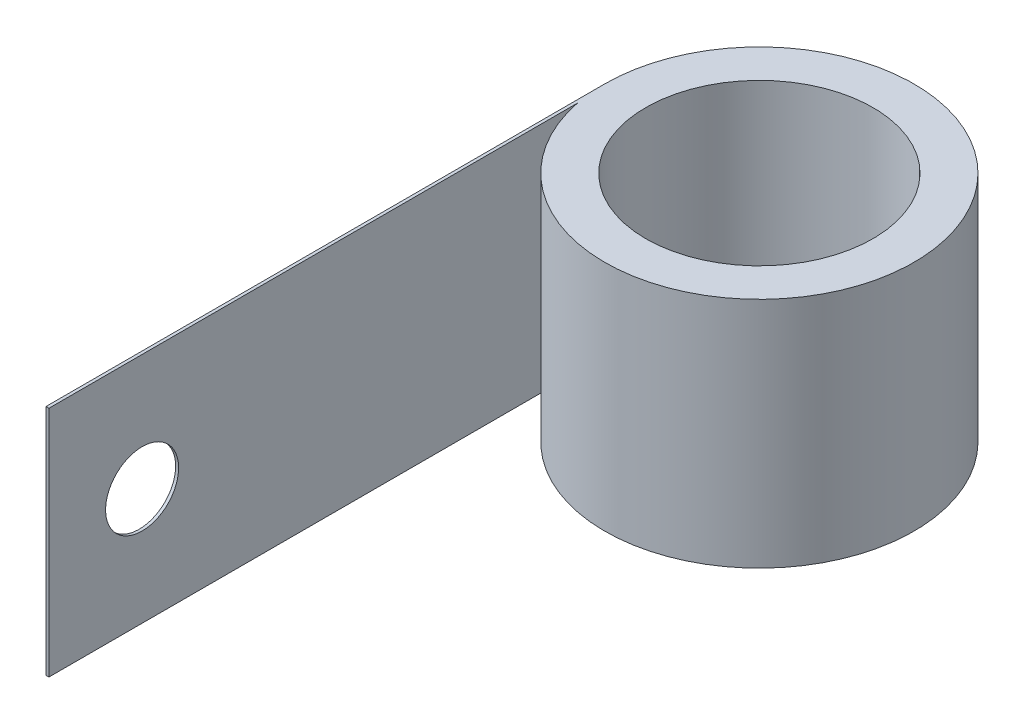
ISO-10303-21;
HEADER;
FILE_DESCRIPTION(('STEP AP214'),'2;1');
FILE_NAME('part.step','',(''),(''),'','','');
FILE_SCHEMA(('AUTOMOTIVE_DESIGN { 1 0 10303 214 1 1 1 1 }'));
ENDSEC;
DATA;
#1=APPLICATION_CONTEXT('core data for automotive mechanical design processes');
#2=APPLICATION_PROTOCOL_DEFINITION('international standard','automotive_design',2000,#1);
#3=PRODUCT_CONTEXT('',#1,'mechanical');
#4=PRODUCT('Part','Part','',(#3));
#5=PRODUCT_RELATED_PRODUCT_CATEGORY('part','',(#4));
#6=PRODUCT_DEFINITION_FORMATION('','',#4);
#7=PRODUCT_DEFINITION_CONTEXT('part definition',#1,'design');
#8=PRODUCT_DEFINITION('design','',#6,#7);
#9=PRODUCT_DEFINITION_SHAPE('','',#8);
#10=(LENGTH_UNIT() NAMED_UNIT(*) SI_UNIT(.MILLI.,.METRE.));
#11=(NAMED_UNIT(*) PLANE_ANGLE_UNIT() SI_UNIT($,.RADIAN.));
#12=(NAMED_UNIT(*) SI_UNIT($,.STERADIAN.) SOLID_ANGLE_UNIT());
#13=UNCERTAINTY_MEASURE_WITH_UNIT(LENGTH_MEASURE(1.E-05),#10,'distance_accuracy_value','');
#14=(GEOMETRIC_REPRESENTATION_CONTEXT(3) GLOBAL_UNCERTAINTY_ASSIGNED_CONTEXT((#13)) GLOBAL_UNIT_ASSIGNED_CONTEXT((#10,
#11,#12)) REPRESENTATION_CONTEXT('',''));
#15=CARTESIAN_POINT('',(0.,0.,0.));
#16=DIRECTION('',(0.,0.,1.));
#17=DIRECTION('',(1.,0.,0.));
#18=AXIS2_PLACEMENT_3D('',#15,#16,#17);
#19=CARTESIAN_POINT('',(-10.541,7.9375,31.75));
#20=DIRECTION('',(1.,0.,0.));
#21=DIRECTION('',(0.,0.,-1.));
#22=AXIS2_PLACEMENT_3D('',#19,#20,#21);
#23=CYLINDRICAL_SURFACE('',#22,2.4892);
#24=CARTESIAN_POINT('',(-10.541,7.9375,31.75));
#25=DIRECTION('',(1.,0.,0.));
#26=DIRECTION('',(0.,0.,-1.));
#27=AXIS2_PLACEMENT_3D('',#24,#25,#26);
#28=CIRCLE('',#27,2.4892);
#29=CARTESIAN_POINT('',(-10.541,7.9375,29.2608));
#30=VERTEX_POINT('',#29);
#31=EDGE_CURVE('E93',#30,#30,#28,.T.);
#32=ORIENTED_EDGE('',*,*,#31,.F.);
#33=EDGE_LOOP('',(#32));
#34=FACE_BOUND('',#33,.T.);
#35=CARTESIAN_POINT('',(-10.3378,7.9375,31.75));
#36=DIRECTION('',(1.,0.,0.));
#37=DIRECTION('',(0.,0.,-1.));
#38=AXIS2_PLACEMENT_3D('',#35,#36,#37);
#39=CIRCLE('',#38,2.4892);
#40=CARTESIAN_POINT('',(-10.3378,7.9375,29.2608));
#41=VERTEX_POINT('',#40);
#42=EDGE_CURVE('E11',#41,#41,#39,.T.);
#43=ORIENTED_EDGE('',*,*,#42,.T.);
#44=EDGE_LOOP('',(#43));
#45=FACE_BOUND('',#44,.T.);
#46=ADVANCED_FACE('F16',(#34,#45),#23,.F.);
#47=CARTESIAN_POINT('',(0.,15.875,0.));
#48=DIRECTION('',(0.,-1.,0.));
#49=DIRECTION('',(0.,0.,-1.));
#50=AXIS2_PLACEMENT_3D('',#47,#48,#49);
#51=CYLINDRICAL_SURFACE('',#50,7.747);
#52=CARTESIAN_POINT('',(0.,15.875,0.));
#53=DIRECTION('',(0.,1.,0.));
#54=DIRECTION('',(0.,0.,1.));
#55=AXIS2_PLACEMENT_3D('',#52,#53,#54);
#56=CIRCLE('',#55,7.747);
#57=CARTESIAN_POINT('',(0.,15.875,7.747));
#58=VERTEX_POINT('',#57);
#59=EDGE_CURVE('E119',#58,#58,#56,.T.);
#60=ORIENTED_EDGE('',*,*,#59,.T.);
#61=EDGE_LOOP('',(#60));
#62=FACE_BOUND('',#61,.T.);
#63=CARTESIAN_POINT('',(0.,0.,0.));
#64=DIRECTION('',(0.,1.,0.));
#65=DIRECTION('',(0.,0.,1.));
#66=AXIS2_PLACEMENT_3D('',#63,#64,#65);
#67=CIRCLE('',#66,7.747);
#68=CARTESIAN_POINT('',(0.,0.,7.747));
#69=VERTEX_POINT('',#68);
#70=EDGE_CURVE('E127',#69,#69,#67,.T.);
#71=ORIENTED_EDGE('',*,*,#70,.F.);
#72=EDGE_LOOP('',(#71));
#73=FACE_BOUND('',#72,.T.);
#74=ADVANCED_FACE('F255',(#62,#73),#51,.F.);
#75=CARTESIAN_POINT('',(-10.3378,15.875,38.1));
#76=DIRECTION('',(-1.,0.,0.));
#77=DIRECTION('',(0.,0.,1.));
#78=AXIS2_PLACEMENT_3D('',#75,#76,#77);
#79=PLANE('',#78);
#80=ORIENTED_EDGE('',*,*,#42,.F.);
#81=EDGE_LOOP('',(#80));
#82=FACE_BOUND('',#81,.T.);
#83=DIRECTION('',(0.,0.,-1.));
#84=VECTOR('',#83,1.);
#85=CARTESIAN_POINT('',(-10.3378,0.,38.1));
#86=LINE('',#85,#84);
#87=CARTESIAN_POINT('',(-10.3378,0.,38.1));
#88=VERTEX_POINT('',#87);
#89=CARTESIAN_POINT('',(-10.3378,0.,2.05975050916371));
#90=VERTEX_POINT('',#89);
#91=EDGE_CURVE('E118',#88,#90,#86,.T.);
#92=ORIENTED_EDGE('',*,*,#91,.T.);
#93=DIRECTION('',(0.,-1.,0.));
#94=VECTOR('',#93,1.);
#95=CARTESIAN_POINT('',(-10.3378,15.875,2.05975050916371));
#96=LINE('',#95,#94);
#97=CARTESIAN_POINT('',(-10.3378,15.875,2.05975050916371));
#98=VERTEX_POINT('',#97);
#99=EDGE_CURVE('E94',#98,#90,#96,.T.);
#100=ORIENTED_EDGE('',*,*,#99,.F.);
#101=DIRECTION('',(0.,0.,-1.));
#102=VECTOR('',#101,1.);
#103=CARTESIAN_POINT('',(-10.3378,15.875,38.1));
#104=LINE('',#103,#102);
#105=CARTESIAN_POINT('',(-10.3378,15.875,38.1));
#106=VERTEX_POINT('',#105);
#107=EDGE_CURVE('E20',#106,#98,#104,.T.);
#108=ORIENTED_EDGE('',*,*,#107,.F.);
#109=DIRECTION('',(0.,-1.,0.));
#110=VECTOR('',#109,1.);
#111=CARTESIAN_POINT('',(-10.3378,15.875,38.1));
#112=LINE('',#111,#110);
#113=EDGE_CURVE('E27',#106,#88,#112,.T.);
#114=ORIENTED_EDGE('',*,*,#113,.T.);
#115=EDGE_LOOP('',(#92,#100,#108,#114));
#116=FACE_BOUND('',#115,.T.);
#117=ADVANCED_FACE('F18',(#82,#116),#79,.F.);
#118=CARTESIAN_POINT('',(-10.541,15.875,38.1));
#119=DIRECTION('',(0.,0.,-1.));
#120=DIRECTION('',(0.,-1.,0.));
#121=AXIS2_PLACEMENT_3D('',#118,#119,#120);
#122=PLANE('',#121);
#123=DIRECTION('',(1.,0.,0.));
#124=VECTOR('',#123,1.);
#125=CARTESIAN_POINT('',(-10.541,0.,38.1));
#126=LINE('',#125,#124);
#127=CARTESIAN_POINT('',(-10.541,0.,38.1));
#128=VERTEX_POINT('',#127);
#129=EDGE_CURVE('E122',#128,#88,#126,.T.);
#130=ORIENTED_EDGE('',*,*,#129,.T.);
#131=ORIENTED_EDGE('',*,*,#113,.F.);
#132=DIRECTION('',(1.,0.,0.));
#133=VECTOR('',#132,1.);
#134=CARTESIAN_POINT('',(-10.541,15.875,38.1));
#135=LINE('',#134,#133);
#136=CARTESIAN_POINT('',(-10.541,15.875,38.1));
#137=VERTEX_POINT('',#136);
#138=EDGE_CURVE('E96',#137,#106,#135,.T.);
#139=ORIENTED_EDGE('',*,*,#138,.F.);
#140=DIRECTION('',(0.,-1.,0.));
#141=VECTOR('',#140,1.);
#142=CARTESIAN_POINT('',(-10.541,15.875,38.1));
#143=LINE('',#142,#141);
#144=EDGE_CURVE('E84',#137,#128,#143,.T.);
#145=ORIENTED_EDGE('',*,*,#144,.T.);
#146=EDGE_LOOP('',(#130,#131,#139,#145));
#147=FACE_BOUND('',#146,.T.);
#148=ADVANCED_FACE('F97',(#147),#122,.F.);
#149=CARTESIAN_POINT('',(-10.541,15.875,0.));
#150=DIRECTION('',(1.,0.,0.));
#151=DIRECTION('',(0.,0.,-1.));
#152=AXIS2_PLACEMENT_3D('',#149,#150,#151);
#153=PLANE('',#152);
#154=ORIENTED_EDGE('',*,*,#31,.T.);
#155=EDGE_LOOP('',(#154));
#156=FACE_BOUND('',#155,.T.);
#157=DIRECTION('',(0.,0.,1.));
#158=VECTOR('',#157,1.);
#159=CARTESIAN_POINT('',(-10.541,0.,0.));
#160=LINE('',#159,#158);
#161=CARTESIAN_POINT('',(-10.541,0.,0.));
#162=VERTEX_POINT('',#161);
#163=EDGE_CURVE('E90',#162,#128,#160,.T.);
#164=ORIENTED_EDGE('',*,*,#163,.T.);
#165=ORIENTED_EDGE('',*,*,#144,.F.);
#166=DIRECTION('',(0.,0.,1.));
#167=VECTOR('',#166,1.);
#168=CARTESIAN_POINT('',(-10.541,15.875,0.));
#169=LINE('',#168,#167);
#170=CARTESIAN_POINT('',(-10.541,15.875,0.));
#171=VERTEX_POINT('',#170);
#172=EDGE_CURVE('E87',#171,#137,#169,.T.);
#173=ORIENTED_EDGE('',*,*,#172,.F.);
#174=DIRECTION('',(0.,-1.,0.));
#175=VECTOR('',#174,1.);
#176=CARTESIAN_POINT('',(-10.541,15.875,0.));
#177=LINE('',#176,#175);
#178=EDGE_CURVE('E136',#171,#162,#177,.T.);
#179=ORIENTED_EDGE('',*,*,#178,.T.);
#180=EDGE_LOOP('',(#164,#165,#173,#179));
#181=FACE_BOUND('',#180,.T.);
#182=ADVANCED_FACE('F85',(#156,#181),#153,.F.);
#183=CARTESIAN_POINT('',(0.,15.875,0.));
#184=DIRECTION('',(0.,-1.,0.));
#185=DIRECTION('',(0.,0.,-1.));
#186=AXIS2_PLACEMENT_3D('',#183,#184,#185);
#187=CYLINDRICAL_SURFACE('',#186,10.541);
#188=CARTESIAN_POINT('',(0.,0.,0.));
#189=DIRECTION('',(0.,1.,0.));
#190=DIRECTION('',(0.,0.,1.));
#191=AXIS2_PLACEMENT_3D('',#188,#189,#190);
#192=CIRCLE('',#191,10.541);
#193=EDGE_CURVE('E114',#90,#162,#192,.T.);
#194=ORIENTED_EDGE('',*,*,#193,.T.);
#195=ORIENTED_EDGE('',*,*,#178,.F.);
#196=CARTESIAN_POINT('',(0.,15.875,0.));
#197=DIRECTION('',(0.,1.,0.));
#198=DIRECTION('',(0.,0.,1.));
#199=AXIS2_PLACEMENT_3D('',#196,#197,#198);
#200=CIRCLE('',#199,10.541);
#201=EDGE_CURVE('E104',#98,#171,#200,.T.);
#202=ORIENTED_EDGE('',*,*,#201,.F.);
#203=ORIENTED_EDGE('',*,*,#99,.T.);
#204=EDGE_LOOP('',(#194,#195,#202,#203));
#205=FACE_BOUND('',#204,.T.);
#206=ADVANCED_FACE('F145',(#205),#187,.T.);
#207=CARTESIAN_POINT('',(0.,0.,0.));
#208=DIRECTION('',(0.,1.,0.));
#209=DIRECTION('',(1.,0.,0.));
#210=AXIS2_PLACEMENT_3D('',#207,#208,#209);
#211=PLANE('',#210);
#212=ORIENTED_EDGE('',*,*,#70,.T.);
#213=EDGE_LOOP('',(#212));
#214=FACE_BOUND('',#213,.T.);
#215=ORIENTED_EDGE('',*,*,#193,.F.);
#216=ORIENTED_EDGE('',*,*,#91,.F.);
#217=ORIENTED_EDGE('',*,*,#129,.F.);
#218=ORIENTED_EDGE('',*,*,#163,.F.);
#219=EDGE_LOOP('',(#215,#216,#217,#218));
#220=FACE_BOUND('',#219,.T.);
#221=ADVANCED_FACE('F143',(#214,#220),#211,.F.);
#222=CARTESIAN_POINT('',(0.,15.875,0.));
#223=DIRECTION('',(0.,1.,0.));
#224=DIRECTION('',(1.,0.,0.));
#225=AXIS2_PLACEMENT_3D('',#222,#223,#224);
#226=PLANE('',#225);
#227=ORIENTED_EDGE('',*,*,#59,.F.);
#228=EDGE_LOOP('',(#227));
#229=FACE_BOUND('',#228,.T.);
#230=ORIENTED_EDGE('',*,*,#201,.T.);
#231=ORIENTED_EDGE('',*,*,#172,.T.);
#232=ORIENTED_EDGE('',*,*,#138,.T.);
#233=ORIENTED_EDGE('',*,*,#107,.T.);
#234=EDGE_LOOP('',(#230,#231,#232,#233));
#235=FACE_BOUND('',#234,.T.);
#236=ADVANCED_FACE('F102',(#229,#235),#226,.T.);
#237=CLOSED_SHELL('',(#46,#74,#117,#148,#182,#206,#221,#236));
#238=MANIFOLD_SOLID_BREP('B1',#237);
#239=ADVANCED_BREP_SHAPE_REPRESENTATION('',(#18,#238),#14);
#240=SHAPE_DEFINITION_REPRESENTATION(#9,#239);
ENDSEC;
END-ISO-10303-21;
